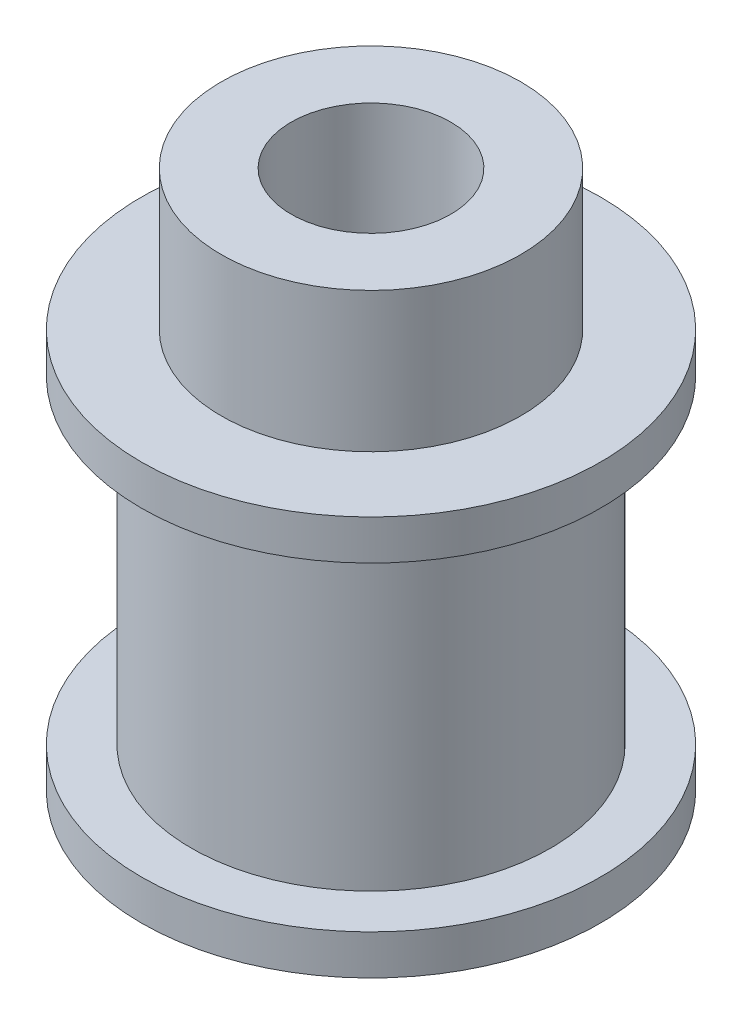
ISO-10303-21;
HEADER;
FILE_DESCRIPTION(('STEP AP214'),'2;1');
FILE_NAME('part.step','',(''),(''),'','','');
FILE_SCHEMA(('AUTOMOTIVE_DESIGN { 1 0 10303 214 1 1 1 1 }'));
ENDSEC;
DATA;
#1=APPLICATION_CONTEXT('core data for automotive mechanical design processes');
#2=APPLICATION_PROTOCOL_DEFINITION('international standard','automotive_design',2000,#1);
#3=PRODUCT_CONTEXT('',#1,'mechanical');
#4=PRODUCT('Part','Part','',(#3));
#5=PRODUCT_RELATED_PRODUCT_CATEGORY('part','',(#4));
#6=PRODUCT_DEFINITION_FORMATION('','',#4);
#7=PRODUCT_DEFINITION_CONTEXT('part definition',#1,'design');
#8=PRODUCT_DEFINITION('design','',#6,#7);
#9=PRODUCT_DEFINITION_SHAPE('','',#8);
#10=(LENGTH_UNIT() NAMED_UNIT(*) SI_UNIT(.MILLI.,.METRE.));
#11=(NAMED_UNIT(*) PLANE_ANGLE_UNIT() SI_UNIT($,.RADIAN.));
#12=(NAMED_UNIT(*) SI_UNIT($,.STERADIAN.) SOLID_ANGLE_UNIT());
#13=UNCERTAINTY_MEASURE_WITH_UNIT(LENGTH_MEASURE(1.E-05),#10,'distance_accuracy_value','');
#14=(GEOMETRIC_REPRESENTATION_CONTEXT(3) GLOBAL_UNCERTAINTY_ASSIGNED_CONTEXT((#13)) GLOBAL_UNIT_ASSIGNED_CONTEXT((#10,
#11,#12)) REPRESENTATION_CONTEXT('',''));
#15=CARTESIAN_POINT('',(0.,0.,0.));
#16=DIRECTION('',(0.,0.,1.));
#17=DIRECTION('',(1.,0.,0.));
#18=AXIS2_PLACEMENT_3D('',#15,#16,#17);
#19=CARTESIAN_POINT('',(0.,0.,0.));
#20=DIRECTION('',(0.,-1.,0.));
#21=DIRECTION('',(0.,0.,-1.));
#22=AXIS2_PLACEMENT_3D('',#19,#20,#21);
#23=CYLINDRICAL_SURFACE('',#22,4.);
#24=CARTESIAN_POINT('',(0.,27.,0.));
#25=DIRECTION('',(0.,-1.,0.));
#26=DIRECTION('',(0.,0.,-1.));
#27=AXIS2_PLACEMENT_3D('',#24,#25,#26);
#28=CIRCLE('',#27,4.);
#29=CARTESIAN_POINT('',(0.,27.,-4.));
#30=VERTEX_POINT('',#29);
#31=EDGE_CURVE('E64',#30,#30,#28,.T.);
#32=ORIENTED_EDGE('',*,*,#31,.F.);
#33=EDGE_LOOP('',(#32));
#34=FACE_BOUND('',#33,.T.);
#35=CARTESIAN_POINT('',(0.,0.,0.));
#36=DIRECTION('',(0.,-1.,0.));
#37=DIRECTION('',(0.,0.,-1.));
#38=AXIS2_PLACEMENT_3D('',#35,#36,#37);
#39=CIRCLE('',#38,4.);
#40=CARTESIAN_POINT('',(0.,0.,-4.));
#41=VERTEX_POINT('',#40);
#42=EDGE_CURVE('E10',#41,#41,#39,.T.);
#43=ORIENTED_EDGE('',*,*,#42,.T.);
#44=EDGE_LOOP('',(#43));
#45=FACE_BOUND('',#44,.T.);
#46=ADVANCED_FACE('F30',(#34,#45),#23,.F.);
#47=CARTESIAN_POINT('',(-4.,0.,0.));
#48=DIRECTION('',(0.,1.,0.));
#49=DIRECTION('',(0.,0.,1.));
#50=AXIS2_PLACEMENT_3D('',#47,#48,#49);
#51=PLANE('',#50);
#52=ORIENTED_EDGE('',*,*,#42,.F.);
#53=EDGE_LOOP('',(#52));
#54=FACE_BOUND('',#53,.T.);
#55=CARTESIAN_POINT('',(0.,0.,0.));
#56=DIRECTION('',(0.,-1.,0.));
#57=DIRECTION('',(0.,0.,-1.));
#58=AXIS2_PLACEMENT_3D('',#55,#56,#57);
#59=CIRCLE('',#58,11.5);
#60=CARTESIAN_POINT('',(0.,0.,-11.5));
#61=VERTEX_POINT('',#60);
#62=EDGE_CURVE('E36',#61,#61,#59,.T.);
#63=ORIENTED_EDGE('',*,*,#62,.T.);
#64=EDGE_LOOP('',(#63));
#65=FACE_BOUND('',#64,.T.);
#66=ADVANCED_FACE('F71',(#54,#65),#51,.F.);
#67=CARTESIAN_POINT('',(0.,0.,0.));
#68=DIRECTION('',(0.,-1.,0.));
#69=DIRECTION('',(0.,0.,-1.));
#70=AXIS2_PLACEMENT_3D('',#67,#68,#69);
#71=CYLINDRICAL_SURFACE('',#70,11.5);
#72=ORIENTED_EDGE('',*,*,#62,.F.);
#73=EDGE_LOOP('',(#72));
#74=FACE_BOUND('',#73,.T.);
#75=CARTESIAN_POINT('',(0.,2.,0.));
#76=DIRECTION('',(0.,-1.,0.));
#77=DIRECTION('',(0.,0.,-1.));
#78=AXIS2_PLACEMENT_3D('',#75,#76,#77);
#79=CIRCLE('',#78,11.5);
#80=CARTESIAN_POINT('',(0.,2.,-11.5));
#81=VERTEX_POINT('',#80);
#82=EDGE_CURVE('E40',#81,#81,#79,.T.);
#83=ORIENTED_EDGE('',*,*,#82,.T.);
#84=EDGE_LOOP('',(#83));
#85=FACE_BOUND('',#84,.T.);
#86=ADVANCED_FACE('F75',(#74,#85),#71,.T.);
#87=CARTESIAN_POINT('',(-11.5,2.,0.));
#88=DIRECTION('',(0.,-1.,0.));
#89=DIRECTION('',(0.,0.,-1.));
#90=AXIS2_PLACEMENT_3D('',#87,#88,#89);
#91=PLANE('',#90);
#92=ORIENTED_EDGE('',*,*,#82,.F.);
#93=EDGE_LOOP('',(#92));
#94=FACE_BOUND('',#93,.T.);
#95=CARTESIAN_POINT('',(0.,2.,0.));
#96=DIRECTION('',(0.,-1.,0.));
#97=DIRECTION('',(0.,0.,-1.));
#98=AXIS2_PLACEMENT_3D('',#95,#96,#97);
#99=CIRCLE('',#98,9.);
#100=CARTESIAN_POINT('',(0.,2.,-9.));
#101=VERTEX_POINT('',#100);
#102=EDGE_CURVE('E44',#101,#101,#99,.T.);
#103=ORIENTED_EDGE('',*,*,#102,.T.);
#104=EDGE_LOOP('',(#103));
#105=FACE_BOUND('',#104,.T.);
#106=ADVANCED_FACE('F80',(#94,#105),#91,.F.);
#107=CARTESIAN_POINT('',(0.,0.,0.));
#108=DIRECTION('',(0.,-1.,0.));
#109=DIRECTION('',(0.,0.,-1.));
#110=AXIS2_PLACEMENT_3D('',#107,#108,#109);
#111=CYLINDRICAL_SURFACE('',#110,9.);
#112=ORIENTED_EDGE('',*,*,#102,.F.);
#113=EDGE_LOOP('',(#112));
#114=FACE_BOUND('',#113,.T.);
#115=CARTESIAN_POINT('',(0.,18.,0.));
#116=DIRECTION('',(0.,-1.,0.));
#117=DIRECTION('',(0.,0.,-1.));
#118=AXIS2_PLACEMENT_3D('',#115,#116,#117);
#119=CIRCLE('',#118,9.);
#120=CARTESIAN_POINT('',(0.,18.,-9.));
#121=VERTEX_POINT('',#120);
#122=EDGE_CURVE('E49',#121,#121,#119,.T.);
#123=ORIENTED_EDGE('',*,*,#122,.T.);
#124=EDGE_LOOP('',(#123));
#125=FACE_BOUND('',#124,.T.);
#126=ADVANCED_FACE('F86',(#114,#125),#111,.T.);
#127=CARTESIAN_POINT('',(-9.,18.,0.));
#128=DIRECTION('',(0.,1.,0.));
#129=DIRECTION('',(0.,0.,1.));
#130=AXIS2_PLACEMENT_3D('',#127,#128,#129);
#131=PLANE('',#130);
#132=ORIENTED_EDGE('',*,*,#122,.F.);
#133=EDGE_LOOP('',(#132));
#134=FACE_BOUND('',#133,.T.);
#135=CARTESIAN_POINT('',(0.,18.,0.));
#136=DIRECTION('',(0.,-1.,0.));
#137=DIRECTION('',(0.,0.,-1.));
#138=AXIS2_PLACEMENT_3D('',#135,#136,#137);
#139=CIRCLE('',#138,11.5);
#140=CARTESIAN_POINT('',(0.,18.,-11.5));
#141=VERTEX_POINT('',#140);
#142=EDGE_CURVE('E52',#141,#141,#139,.T.);
#143=ORIENTED_EDGE('',*,*,#142,.T.);
#144=EDGE_LOOP('',(#143));
#145=FACE_BOUND('',#144,.T.);
#146=ADVANCED_FACE('F90',(#134,#145),#131,.F.);
#147=CARTESIAN_POINT('',(0.,0.,0.));
#148=DIRECTION('',(0.,-1.,0.));
#149=DIRECTION('',(0.,0.,-1.));
#150=AXIS2_PLACEMENT_3D('',#147,#148,#149);
#151=CYLINDRICAL_SURFACE('',#150,11.5);
#152=ORIENTED_EDGE('',*,*,#142,.F.);
#153=EDGE_LOOP('',(#152));
#154=FACE_BOUND('',#153,.T.);
#155=CARTESIAN_POINT('',(0.,20.,0.));
#156=DIRECTION('',(0.,-1.,0.));
#157=DIRECTION('',(0.,0.,-1.));
#158=AXIS2_PLACEMENT_3D('',#155,#156,#157);
#159=CIRCLE('',#158,11.5);
#160=CARTESIAN_POINT('',(0.,20.,-11.5));
#161=VERTEX_POINT('',#160);
#162=EDGE_CURVE('E55',#161,#161,#159,.T.);
#163=ORIENTED_EDGE('',*,*,#162,.T.);
#164=EDGE_LOOP('',(#163));
#165=FACE_BOUND('',#164,.T.);
#166=ADVANCED_FACE('F94',(#154,#165),#151,.T.);
#167=CARTESIAN_POINT('',(-11.5,20.,0.));
#168=DIRECTION('',(0.,-1.,0.));
#169=DIRECTION('',(0.,0.,-1.));
#170=AXIS2_PLACEMENT_3D('',#167,#168,#169);
#171=PLANE('',#170);
#172=ORIENTED_EDGE('',*,*,#162,.F.);
#173=EDGE_LOOP('',(#172));
#174=FACE_BOUND('',#173,.T.);
#175=CARTESIAN_POINT('',(0.,20.,0.));
#176=DIRECTION('',(0.,-1.,0.));
#177=DIRECTION('',(0.,0.,-1.));
#178=AXIS2_PLACEMENT_3D('',#175,#176,#177);
#179=CIRCLE('',#178,7.5);
#180=CARTESIAN_POINT('',(0.,20.,-7.5));
#181=VERTEX_POINT('',#180);
#182=EDGE_CURVE('E58',#181,#181,#179,.T.);
#183=ORIENTED_EDGE('',*,*,#182,.T.);
#184=EDGE_LOOP('',(#183));
#185=FACE_BOUND('',#184,.T.);
#186=ADVANCED_FACE('F98',(#174,#185),#171,.F.);
#187=CARTESIAN_POINT('',(0.,0.,0.));
#188=DIRECTION('',(0.,-1.,0.));
#189=DIRECTION('',(0.,0.,-1.));
#190=AXIS2_PLACEMENT_3D('',#187,#188,#189);
#191=CYLINDRICAL_SURFACE('',#190,7.5);
#192=ORIENTED_EDGE('',*,*,#182,.F.);
#193=EDGE_LOOP('',(#192));
#194=FACE_BOUND('',#193,.T.);
#195=CARTESIAN_POINT('',(0.,27.,0.));
#196=DIRECTION('',(0.,-1.,0.));
#197=DIRECTION('',(0.,0.,-1.));
#198=AXIS2_PLACEMENT_3D('',#195,#196,#197);
#199=CIRCLE('',#198,7.5);
#200=CARTESIAN_POINT('',(0.,27.,-7.5));
#201=VERTEX_POINT('',#200);
#202=EDGE_CURVE('E61',#201,#201,#199,.T.);
#203=ORIENTED_EDGE('',*,*,#202,.T.);
#204=EDGE_LOOP('',(#203));
#205=FACE_BOUND('',#204,.T.);
#206=ADVANCED_FACE('F102',(#194,#205),#191,.T.);
#207=CARTESIAN_POINT('',(-7.5,27.,0.));
#208=DIRECTION('',(0.,-1.,0.));
#209=DIRECTION('',(0.,0.,-1.));
#210=AXIS2_PLACEMENT_3D('',#207,#208,#209);
#211=PLANE('',#210);
#212=ORIENTED_EDGE('',*,*,#202,.F.);
#213=EDGE_LOOP('',(#212));
#214=FACE_BOUND('',#213,.T.);
#215=ORIENTED_EDGE('',*,*,#31,.T.);
#216=EDGE_LOOP('',(#215));
#217=FACE_BOUND('',#216,.T.);
#218=ADVANCED_FACE('F68',(#214,#217),#211,.F.);
#219=CLOSED_SHELL('',(#46,#66,#86,#106,#126,#146,#166,#186,#206,#218));
#220=MANIFOLD_SOLID_BREP('B2',#219);
#221=ADVANCED_BREP_SHAPE_REPRESENTATION('',(#18,#220),#14);
#222=SHAPE_DEFINITION_REPRESENTATION(#9,#221);
ENDSEC;
END-ISO-10303-21;
